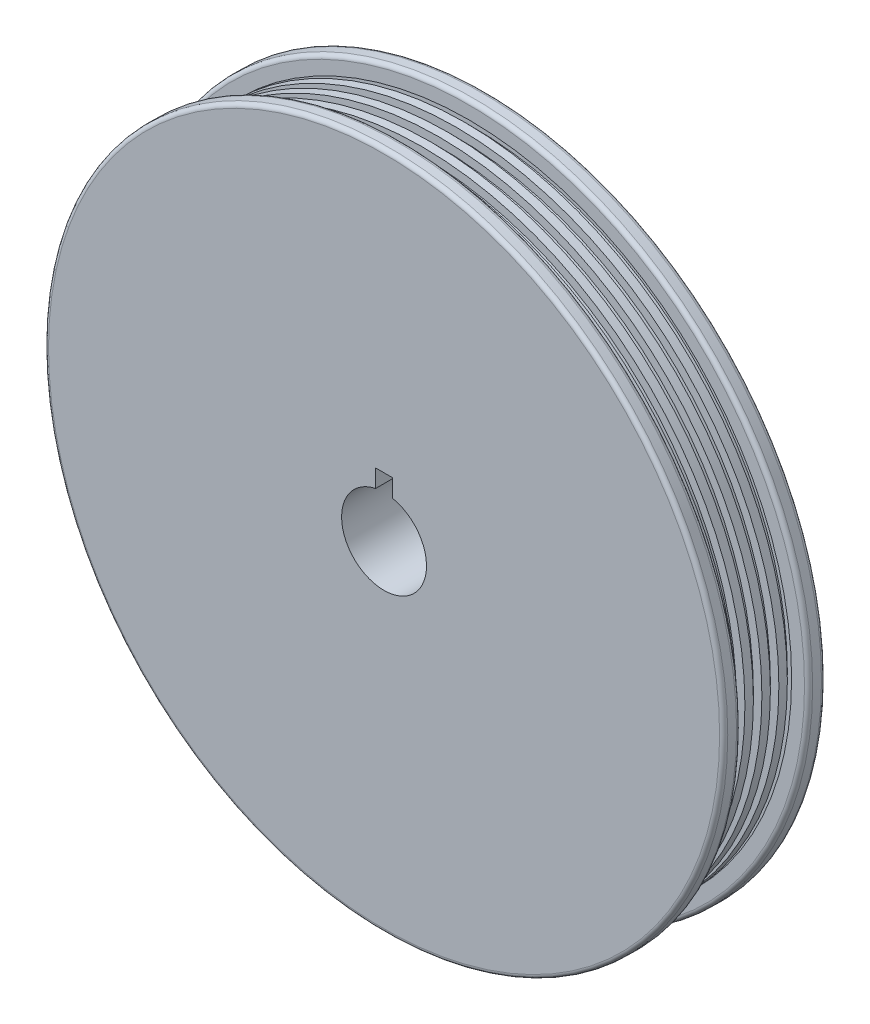
ISO-10303-21;
HEADER;
FILE_DESCRIPTION(('STEP AP214'),'2;1');
FILE_NAME('part.step','',(''),(''),'','','');
FILE_SCHEMA(('AUTOMOTIVE_DESIGN { 1 0 10303 214 1 1 1 1 }'));
ENDSEC;
DATA;
#1=APPLICATION_CONTEXT('core data for automotive mechanical design processes');
#2=APPLICATION_PROTOCOL_DEFINITION('international standard','automotive_design',2000,#1);
#3=PRODUCT_CONTEXT('',#1,'mechanical');
#4=PRODUCT('Part','Part','',(#3));
#5=PRODUCT_RELATED_PRODUCT_CATEGORY('part','',(#4));
#6=PRODUCT_DEFINITION_FORMATION('','',#4);
#7=PRODUCT_DEFINITION_CONTEXT('part definition',#1,'design');
#8=PRODUCT_DEFINITION('design','',#6,#7);
#9=PRODUCT_DEFINITION_SHAPE('','',#8);
#10=(LENGTH_UNIT() NAMED_UNIT(*) SI_UNIT(.MILLI.,.METRE.));
#11=(NAMED_UNIT(*) PLANE_ANGLE_UNIT() SI_UNIT($,.RADIAN.));
#12=(NAMED_UNIT(*) SI_UNIT($,.STERADIAN.) SOLID_ANGLE_UNIT());
#13=UNCERTAINTY_MEASURE_WITH_UNIT(LENGTH_MEASURE(1.E-05),#10,'distance_accuracy_value','');
#14=(GEOMETRIC_REPRESENTATION_CONTEXT(3) GLOBAL_UNCERTAINTY_ASSIGNED_CONTEXT((#13)) GLOBAL_UNIT_ASSIGNED_CONTEXT((#10,
#11,#12)) REPRESENTATION_CONTEXT('',''));
#15=CARTESIAN_POINT('',(0.,0.,0.));
#16=DIRECTION('',(0.,0.,1.));
#17=DIRECTION('',(1.,0.,0.));
#18=AXIS2_PLACEMENT_3D('',#15,#16,#17);
#19=CARTESIAN_POINT('',(0.,0.,19.05));
#20=DIRECTION('',(0.,0.,-1.));
#21=DIRECTION('',(-1.,0.,0.));
#22=AXIS2_PLACEMENT_3D('',#19,#20,#21);
#23=CYLINDRICAL_SURFACE('',#22,127.);
#24=CARTESIAN_POINT('',(0.,0.,-17.526));
#25=DIRECTION('',(0.,0.,1.));
#26=DIRECTION('',(1.,0.,0.));
#27=AXIS2_PLACEMENT_3D('',#24,#25,#26);
#28=CIRCLE('',#27,127.);
#29=CARTESIAN_POINT('',(-127.,0.,-17.526));
#30=VERTEX_POINT('',#29);
#31=EDGE_CURVE('E180',#30,#30,#28,.T.);
#32=CARTESIAN_POINT('',(0.,0.,-14.224));
#33=DIRECTION('',(0.,0.,1.));
#34=DIRECTION('',(1.,0.,0.));
#35=AXIS2_PLACEMENT_3D('',#32,#33,#34);
#36=CIRCLE('',#35,127.);
#37=CARTESIAN_POINT('',(-127.,0.,-14.224));
#38=VERTEX_POINT('',#37);
#39=EDGE_CURVE('E175',#38,#38,#36,.F.);
#40=CARTESIAN_POINT('',(-127.,0.,-17.526));
#41=CARTESIAN_POINT('',(-127.,0.,-17.4916041666667));
#42=CARTESIAN_POINT('',(-127.,0.,-17.4572083333333));
#43=CARTESIAN_POINT('',(-127.,0.,-17.3884166666667));
#44=CARTESIAN_POINT('',(-127.,0.,-17.3540208333333));
#45=CARTESIAN_POINT('',(-127.,0.,-17.2852291666667));
#46=CARTESIAN_POINT('',(-127.,0.,-17.2508333333333));
#47=CARTESIAN_POINT('',(-127.,0.,-17.1820416666667));
#48=CARTESIAN_POINT('',(-127.,0.,-17.1476458333333));
#49=CARTESIAN_POINT('',(-127.,0.,-17.0788541666667));
#50=CARTESIAN_POINT('',(-127.,0.,-17.0444583333333));
#51=CARTESIAN_POINT('',(-127.,0.,-16.9756666666667));
#52=CARTESIAN_POINT('',(-127.,0.,-16.9412708333333));
#53=CARTESIAN_POINT('',(-127.,0.,-16.8724791666667));
#54=CARTESIAN_POINT('',(-127.,0.,-16.8380833333333));
#55=CARTESIAN_POINT('',(-127.,0.,-16.7692916666667));
#56=CARTESIAN_POINT('',(-127.,0.,-16.7348958333333));
#57=CARTESIAN_POINT('',(-127.,0.,-16.6661041666667));
#58=CARTESIAN_POINT('',(-127.,0.,-16.6317083333333));
#59=CARTESIAN_POINT('',(-127.,0.,-16.5629166666667));
#60=CARTESIAN_POINT('',(-127.,0.,-16.5285208333333));
#61=CARTESIAN_POINT('',(-127.,0.,-16.4597291666667));
#62=CARTESIAN_POINT('',(-127.,0.,-16.4253333333333));
#63=CARTESIAN_POINT('',(-127.,0.,-16.3565416666667));
#64=CARTESIAN_POINT('',(-127.,0.,-16.3221458333333));
#65=CARTESIAN_POINT('',(-127.,0.,-16.2533541666667));
#66=CARTESIAN_POINT('',(-127.,0.,-16.2189583333333));
#67=CARTESIAN_POINT('',(-127.,0.,-16.1501666666667));
#68=CARTESIAN_POINT('',(-127.,0.,-16.1157708333333));
#69=CARTESIAN_POINT('',(-127.,0.,-16.0469791666667));
#70=CARTESIAN_POINT('',(-127.,0.,-16.0125833333333));
#71=CARTESIAN_POINT('',(-127.,0.,-15.9437916666667));
#72=CARTESIAN_POINT('',(-127.,0.,-15.9093958333333));
#73=CARTESIAN_POINT('',(-127.,0.,-15.8406041666667));
#74=CARTESIAN_POINT('',(-127.,0.,-15.8062083333333));
#75=CARTESIAN_POINT('',(-127.,0.,-15.7374166666667));
#76=CARTESIAN_POINT('',(-127.,0.,-15.7030208333333));
#77=CARTESIAN_POINT('',(-127.,0.,-15.6342291666667));
#78=CARTESIAN_POINT('',(-127.,0.,-15.5998333333333));
#79=CARTESIAN_POINT('',(-127.,0.,-15.5310416666667));
#80=CARTESIAN_POINT('',(-127.,0.,-15.4966458333333));
#81=CARTESIAN_POINT('',(-127.,0.,-15.4278541666667));
#82=CARTESIAN_POINT('',(-127.,0.,-15.3934583333333));
#83=CARTESIAN_POINT('',(-127.,0.,-15.3246666666667));
#84=CARTESIAN_POINT('',(-127.,0.,-15.2902708333333));
#85=CARTESIAN_POINT('',(-127.,0.,-15.2214791666667));
#86=CARTESIAN_POINT('',(-127.,0.,-15.1870833333333));
#87=CARTESIAN_POINT('',(-127.,0.,-15.1182916666667));
#88=CARTESIAN_POINT('',(-127.,0.,-15.0838958333333));
#89=CARTESIAN_POINT('',(-127.,0.,-15.0151041666667));
#90=CARTESIAN_POINT('',(-127.,0.,-14.9807083333333));
#91=CARTESIAN_POINT('',(-127.,0.,-14.9119166666667));
#92=CARTESIAN_POINT('',(-127.,0.,-14.8775208333333));
#93=CARTESIAN_POINT('',(-127.,0.,-14.8087291666667));
#94=CARTESIAN_POINT('',(-127.,0.,-14.7743333333333));
#95=CARTESIAN_POINT('',(-127.,0.,-14.7055416666667));
#96=CARTESIAN_POINT('',(-127.,0.,-14.6711458333333));
#97=CARTESIAN_POINT('',(-127.,0.,-14.6023541666667));
#98=CARTESIAN_POINT('',(-127.,0.,-14.5679583333333));
#99=CARTESIAN_POINT('',(-127.,0.,-14.4991666666667));
#100=CARTESIAN_POINT('',(-127.,0.,-14.4647708333333));
#101=CARTESIAN_POINT('',(-127.,0.,-14.3959791666667));
#102=CARTESIAN_POINT('',(-127.,0.,-14.3615833333333));
#103=CARTESIAN_POINT('',(-127.,0.,-14.2927916666667));
#104=CARTESIAN_POINT('',(-127.,0.,-14.2583958333333));
#105=CARTESIAN_POINT('',(-127.,0.,-14.224));
#106=B_SPLINE_CURVE_WITH_KNOTS('',3,(#40,#41,#42,#43,#44,#45,#46,#47,#48,#49,#50,#51,#52,#53,
#54,#55,#56,#57,#58,#59,#60,#61,#62,#63,#64,#65,#66,#67,#68,#69,#70,#71,#72,#73,#74,#75,#76,#77,
#78,#79,#80,#81,#82,#83,#84,#85,#86,#87,#88,#89,#90,#91,#92,#93,#94,#95,#96,#97,#98,#99,#100,
#101,#102,#103,#104,#105),.UNSPECIFIED.,.F.,.F.,(4,2,2,2,2,2,2,2,2,2,2,2,2,2,2,2,2,2,2,2,2,2,2,
2,2,2,2,2,2,2,2,2,4),(0.,0.103187499999997,0.206375000000002,0.309562499999999,
0.412750000000003,0.515937500000001,0.619124999999998,0.722312500000002,0.8255,
0.928687499999997,1.031875,1.1350625,1.23825,1.3414375,1.444625,1.5478125,1.651,1.7541875,
1.857375,1.9605625,2.06375,2.1669375,2.270125,2.3733125,2.4765,2.5796875,2.682875,2.7860625,
2.88925,2.9924375,3.095625,3.1988125,3.302),.UNSPECIFIED.);
#107=EDGE_CURVE('BSEAM33',#30,#38,#106,.T.);
#108=ORIENTED_EDGE('',*,*,#31,.T.);
#109=ORIENTED_EDGE('',*,*,#39,.T.);
#110=ORIENTED_EDGE('',*,*,#107,.T.);
#111=ORIENTED_EDGE('',*,*,#107,.F.);
#112=EDGE_LOOP('',(#108,#110,#109,#111));
#113=FACE_BOUND('',#112,.T.);
#114=ADVANCED_FACE('F33',(#113),#23,.T.);
#115=CARTESIAN_POINT('',(0.,0.,-19.05));
#116=DIRECTION('',(0.,0.,1.));
#117=DIRECTION('',(1.,0.,0.));
#118=AXIS2_PLACEMENT_3D('',#115,#116,#117);
#119=PLANE('',#118);
#120=DIRECTION('',(0.,-1.,0.));
#121=VECTOR('',#120,1.);
#122=CARTESIAN_POINT('',(-3.175,0.,-19.05));
#123=LINE('',#122,#121);
#124=CARTESIAN_POINT('',(-3.175,22.225,-19.05));
#125=VERTEX_POINT('',#124);
#126=CARTESIAN_POINT('',(-3.175,15.5542598666732,-19.05));
#127=VERTEX_POINT('',#126);
#128=EDGE_CURVE('E105',#125,#127,#123,.T.);
#129=ORIENTED_EDGE('',*,*,#128,.T.);
#130=CARTESIAN_POINT('',(0.,0.,-19.05));
#131=DIRECTION('',(0.,0.,1.));
#132=DIRECTION('',(1.,0.,0.));
#133=AXIS2_PLACEMENT_3D('',#130,#131,#132);
#134=CIRCLE('',#133,15.875);
#135=CARTESIAN_POINT('',(3.175,15.5542598666732,-19.05));
#136=VERTEX_POINT('',#135);
#137=EDGE_CURVE('E108',#127,#136,#134,.T.);
#138=ORIENTED_EDGE('',*,*,#137,.T.);
#139=DIRECTION('',(0.,1.,0.));
#140=VECTOR('',#139,1.);
#141=CARTESIAN_POINT('',(3.175,0.,-19.05));
#142=LINE('',#141,#140);
#143=CARTESIAN_POINT('',(3.175,22.225,-19.05));
#144=VERTEX_POINT('',#143);
#145=EDGE_CURVE('E100',#136,#144,#142,.T.);
#146=ORIENTED_EDGE('',*,*,#145,.T.);
#147=DIRECTION('',(-1.,0.,0.));
#148=VECTOR('',#147,1.);
#149=CARTESIAN_POINT('',(0.,22.225,-19.05));
#150=LINE('',#149,#148);
#151=EDGE_CURVE('E80',#144,#125,#150,.T.);
#152=ORIENTED_EDGE('',*,*,#151,.T.);
#153=EDGE_LOOP('',(#129,#138,#146,#152));
#154=FACE_BOUND('',#153,.T.);
#155=CARTESIAN_POINT('',(0.,0.,-19.05));
#156=DIRECTION('',(0.,0.,1.));
#157=DIRECTION('',(1.,0.,0.));
#158=AXIS2_PLACEMENT_3D('',#155,#156,#157);
#159=CIRCLE('',#158,125.476);
#160=CARTESIAN_POINT('',(125.476,0.,-19.05));
#161=VERTEX_POINT('',#160);
#162=EDGE_CURVE('E183',#161,#161,#159,.F.);
#163=ORIENTED_EDGE('',*,*,#162,.T.);
#164=EDGE_LOOP('',(#163));
#165=FACE_BOUND('',#164,.T.);
#166=ADVANCED_FACE('F218',(#154,#165),#119,.F.);
#167=CARTESIAN_POINT('',(0.,0.,-12.7));
#168=DIRECTION('',(0.,0.,1.));
#169=DIRECTION('',(1.,0.,0.));
#170=AXIS2_PLACEMENT_3D('',#167,#168,#169);
#171=PLANE('',#170);
#172=CARTESIAN_POINT('',(0.,0.,-12.7));
#173=DIRECTION('',(0.,0.,1.));
#174=DIRECTION('',(1.,0.,0.));
#175=AXIS2_PLACEMENT_3D('',#172,#173,#174);
#176=CIRCLE('',#175,125.476);
#177=CARTESIAN_POINT('',(125.476,0.,-12.7));
#178=VERTEX_POINT('',#177);
#179=EDGE_CURVE('E11',#178,#178,#176,.T.);
#180=ORIENTED_EDGE('',*,*,#179,.T.);
#181=EDGE_LOOP('',(#180));
#182=FACE_BOUND('',#181,.T.);
#183=CARTESIAN_POINT('',(0.,0.,-12.7));
#184=DIRECTION('',(0.,0.,1.));
#185=DIRECTION('',(1.,0.,0.));
#186=AXIS2_PLACEMENT_3D('',#183,#184,#185);
#187=CIRCLE('',#186,120.65);
#188=CARTESIAN_POINT('',(120.65,0.,-12.7));
#189=VERTEX_POINT('',#188);
#190=EDGE_CURVE('E162',#189,#189,#187,.T.);
#191=ORIENTED_EDGE('',*,*,#190,.F.);
#192=EDGE_LOOP('',(#191));
#193=FACE_BOUND('',#192,.T.);
#194=ADVANCED_FACE('F224',(#182,#193),#171,.T.);
#195=CARTESIAN_POINT('',(0.,0.,-17.526));
#196=DIRECTION('',(0.,0.,1.));
#197=DIRECTION('',(1.,0.,0.));
#198=AXIS2_PLACEMENT_3D('',#195,#196,#197);
#199=TOROIDAL_SURFACE('',#198,125.476,1.524);
#200=ORIENTED_EDGE('',*,*,#162,.F.);
#201=EDGE_LOOP('',(#200));
#202=FACE_BOUND('',#201,.T.);
#203=ORIENTED_EDGE('',*,*,#31,.F.);
#204=EDGE_LOOP('',(#203));
#205=FACE_BOUND('',#204,.T.);
#206=ADVANCED_FACE('F233',(#202,#205),#199,.T.);
#207=CARTESIAN_POINT('',(0.,0.,-14.224));
#208=DIRECTION('',(0.,0.,1.));
#209=DIRECTION('',(1.,0.,0.));
#210=AXIS2_PLACEMENT_3D('',#207,#208,#209);
#211=TOROIDAL_SURFACE('',#210,125.476,1.524);
#212=ORIENTED_EDGE('',*,*,#39,.F.);
#213=EDGE_LOOP('',(#212));
#214=FACE_BOUND('',#213,.T.);
#215=ORIENTED_EDGE('',*,*,#179,.F.);
#216=EDGE_LOOP('',(#215));
#217=FACE_BOUND('',#216,.T.);
#218=ADVANCED_FACE('F35',(#214,#217),#211,.T.);
#219=CARTESIAN_POINT('',(0.,0.,-14.2875));
#220=DIRECTION('',(0.,0.,1.));
#221=DIRECTION('',(1.,0.,0.));
#222=AXIS2_PLACEMENT_3D('',#219,#220,#221);
#223=CYLINDRICAL_SURFACE('',#222,120.65);
#224=ORIENTED_EDGE('',*,*,#190,.T.);
#225=EDGE_LOOP('',(#224));
#226=FACE_BOUND('',#225,.T.);
#227=CARTESIAN_POINT('',(0.,0.,-14.2875));
#228=DIRECTION('',(0.,0.,1.));
#229=DIRECTION('',(1.,0.,0.));
#230=AXIS2_PLACEMENT_3D('',#227,#228,#229);
#231=CIRCLE('',#230,120.65);
#232=CARTESIAN_POINT('',(120.65,0.,-14.2875));
#233=VERTEX_POINT('',#232);
#234=EDGE_CURVE('E118',#233,#233,#231,.T.);
#235=ORIENTED_EDGE('',*,*,#234,.F.);
#236=EDGE_LOOP('',(#235));
#237=FACE_BOUND('',#236,.T.);
#238=ADVANCED_FACE('F232',(#226,#237),#223,.F.);
#239=CARTESIAN_POINT('',(0.,0.,-14.2875));
#240=DIRECTION('',(0.,0.,1.));
#241=DIRECTION('',(1.,0.,0.));
#242=AXIS2_PLACEMENT_3D('',#239,#240,#241);
#243=PLANE('',#242);
#244=CARTESIAN_POINT('',(0.,0.,-14.2875));
#245=DIRECTION('',(0.,0.,1.));
#246=DIRECTION('',(1.,0.,0.));
#247=AXIS2_PLACEMENT_3D('',#244,#245,#246);
#248=CIRCLE('',#247,117.475);
#249=CARTESIAN_POINT('',(117.475,0.,-14.2875));
#250=VERTEX_POINT('',#249);
#251=EDGE_CURVE('E112',#250,#250,#248,.T.);
#252=ORIENTED_EDGE('',*,*,#251,.F.);
#253=EDGE_LOOP('',(#252));
#254=FACE_BOUND('',#253,.T.);
#255=ORIENTED_EDGE('',*,*,#234,.T.);
#256=EDGE_LOOP('',(#255));
#257=FACE_BOUND('',#256,.T.);
#258=ADVANCED_FACE('F243',(#254,#257),#243,.T.);
#259=CARTESIAN_POINT('',(0.,0.,-11.1125));
#260=DIRECTION('',(0.,0.,1.));
#261=DIRECTION('',(1.,0.,0.));
#262=AXIS2_PLACEMENT_3D('',#259,#260,#261);
#263=PLANE('',#262);
#264=CARTESIAN_POINT('',(0.,0.,-11.1125));
#265=DIRECTION('',(0.,0.,1.));
#266=DIRECTION('',(1.,0.,0.));
#267=AXIS2_PLACEMENT_3D('',#264,#265,#266);
#268=CIRCLE('',#267,117.475);
#269=CARTESIAN_POINT('',(117.475,0.,-11.1125));
#270=VERTEX_POINT('',#269);
#271=EDGE_CURVE('E111',#270,#270,#268,.T.);
#272=ORIENTED_EDGE('',*,*,#271,.T.);
#273=EDGE_LOOP('',(#272));
#274=FACE_BOUND('',#273,.T.);
#275=CARTESIAN_POINT('',(0.,0.,-11.1125));
#276=DIRECTION('',(0.,0.,1.));
#277=DIRECTION('',(1.,0.,0.));
#278=AXIS2_PLACEMENT_3D('',#275,#276,#277);
#279=CIRCLE('',#278,120.65);
#280=CARTESIAN_POINT('',(120.65,0.,-11.1125));
#281=VERTEX_POINT('',#280);
#282=EDGE_CURVE('E115',#281,#281,#279,.T.);
#283=ORIENTED_EDGE('',*,*,#282,.F.);
#284=EDGE_LOOP('',(#283));
#285=FACE_BOUND('',#284,.T.);
#286=ADVANCED_FACE('F248',(#274,#285),#263,.F.);
#287=CARTESIAN_POINT('',(0.,0.,-14.2875));
#288=DIRECTION('',(0.,0.,1.));
#289=DIRECTION('',(1.,0.,0.));
#290=AXIS2_PLACEMENT_3D('',#287,#288,#289);
#291=CYLINDRICAL_SURFACE('',#290,117.475);
#292=ORIENTED_EDGE('',*,*,#251,.T.);
#293=EDGE_LOOP('',(#292));
#294=FACE_BOUND('',#293,.T.);
#295=ORIENTED_EDGE('',*,*,#271,.F.);
#296=EDGE_LOOP('',(#295));
#297=FACE_BOUND('',#296,.T.);
#298=ADVANCED_FACE('F254',(#294,#297),#291,.T.);
#299=CARTESIAN_POINT('',(0.,0.,-12.7));
#300=DIRECTION('',(0.,0.,1.));
#301=DIRECTION('',(1.,0.,0.));
#302=AXIS2_PLACEMENT_3D('',#299,#300,#301);
#303=CYLINDRICAL_SURFACE('',#302,120.65);
#304=ORIENTED_EDGE('',*,*,#282,.T.);
#305=EDGE_LOOP('',(#304));
#306=FACE_BOUND('',#305,.T.);
#307=CARTESIAN_POINT('',(0.,0.,-7.9375));
#308=DIRECTION('',(0.,0.,1.));
#309=DIRECTION('',(1.,0.,0.));
#310=AXIS2_PLACEMENT_3D('',#307,#308,#309);
#311=CIRCLE('',#310,120.65);
#312=CARTESIAN_POINT('',(120.65,0.,-7.9375));
#313=VERTEX_POINT('',#312);
#314=EDGE_CURVE('E131',#313,#313,#311,.T.);
#315=ORIENTED_EDGE('',*,*,#314,.F.);
#316=EDGE_LOOP('',(#315));
#317=FACE_BOUND('',#316,.T.);
#318=ADVANCED_FACE('F287',(#306,#317),#303,.T.);
#319=CARTESIAN_POINT('',(0.,0.,-7.9375));
#320=DIRECTION('',(0.,0.,1.));
#321=DIRECTION('',(1.,0.,0.));
#322=AXIS2_PLACEMENT_3D('',#319,#320,#321);
#323=PLANE('',#322);
#324=CARTESIAN_POINT('',(0.,0.,-7.9375));
#325=DIRECTION('',(0.,0.,1.));
#326=DIRECTION('',(1.,0.,0.));
#327=AXIS2_PLACEMENT_3D('',#324,#325,#326);
#328=CIRCLE('',#327,117.475);
#329=CARTESIAN_POINT('',(117.475,0.,-7.9375));
#330=VERTEX_POINT('',#329);
#331=EDGE_CURVE('E138',#330,#330,#328,.T.);
#332=ORIENTED_EDGE('',*,*,#331,.F.);
#333=EDGE_LOOP('',(#332));
#334=FACE_BOUND('',#333,.T.);
#335=ORIENTED_EDGE('',*,*,#314,.T.);
#336=EDGE_LOOP('',(#335));
#337=FACE_BOUND('',#336,.T.);
#338=ADVANCED_FACE('F284',(#334,#337),#323,.T.);
#339=CARTESIAN_POINT('',(0.,0.,-4.7625));
#340=DIRECTION('',(0.,0.,1.));
#341=DIRECTION('',(1.,0.,0.));
#342=AXIS2_PLACEMENT_3D('',#339,#340,#341);
#343=PLANE('',#342);
#344=CARTESIAN_POINT('',(0.,0.,-4.7625));
#345=DIRECTION('',(0.,0.,1.));
#346=DIRECTION('',(1.,0.,0.));
#347=AXIS2_PLACEMENT_3D('',#344,#345,#346);
#348=CIRCLE('',#347,117.475);
#349=CARTESIAN_POINT('',(117.475,0.,-4.7625));
#350=VERTEX_POINT('',#349);
#351=EDGE_CURVE('E121',#350,#350,#348,.T.);
#352=ORIENTED_EDGE('',*,*,#351,.T.);
#353=EDGE_LOOP('',(#352));
#354=FACE_BOUND('',#353,.T.);
#355=CARTESIAN_POINT('',(0.,0.,-4.7625));
#356=DIRECTION('',(0.,0.,1.));
#357=DIRECTION('',(1.,0.,0.));
#358=AXIS2_PLACEMENT_3D('',#355,#356,#357);
#359=CIRCLE('',#358,120.65);
#360=CARTESIAN_POINT('',(120.65,0.,-4.7625));
#361=VERTEX_POINT('',#360);
#362=EDGE_CURVE('E141',#361,#361,#359,.T.);
#363=ORIENTED_EDGE('',*,*,#362,.F.);
#364=EDGE_LOOP('',(#363));
#365=FACE_BOUND('',#364,.T.);
#366=ADVANCED_FACE('F282',(#354,#365),#343,.F.);
#367=CARTESIAN_POINT('',(0.,0.,-7.9375));
#368=DIRECTION('',(0.,0.,1.));
#369=DIRECTION('',(1.,0.,0.));
#370=AXIS2_PLACEMENT_3D('',#367,#368,#369);
#371=CYLINDRICAL_SURFACE('',#370,117.475);
#372=ORIENTED_EDGE('',*,*,#331,.T.);
#373=EDGE_LOOP('',(#372));
#374=FACE_BOUND('',#373,.T.);
#375=ORIENTED_EDGE('',*,*,#351,.F.);
#376=EDGE_LOOP('',(#375));
#377=FACE_BOUND('',#376,.T.);
#378=ADVANCED_FACE('F278',(#374,#377),#371,.T.);
#379=CARTESIAN_POINT('',(0.,0.,-1.5875));
#380=DIRECTION('',(0.,0.,1.));
#381=DIRECTION('',(1.,0.,0.));
#382=AXIS2_PLACEMENT_3D('',#379,#380,#381);
#383=PLANE('',#382);
#384=CARTESIAN_POINT('',(0.,0.,-1.5875));
#385=DIRECTION('',(0.,0.,1.));
#386=DIRECTION('',(1.,0.,0.));
#387=AXIS2_PLACEMENT_3D('',#384,#385,#386);
#388=CIRCLE('',#387,117.475);
#389=CARTESIAN_POINT('',(117.475,0.,-1.5875));
#390=VERTEX_POINT('',#389);
#391=EDGE_CURVE('E166',#390,#390,#388,.T.);
#392=ORIENTED_EDGE('',*,*,#391,.F.);
#393=EDGE_LOOP('',(#392));
#394=FACE_BOUND('',#393,.T.);
#395=CARTESIAN_POINT('',(0.,0.,-1.5875));
#396=DIRECTION('',(0.,0.,1.));
#397=DIRECTION('',(1.,0.,0.));
#398=AXIS2_PLACEMENT_3D('',#395,#396,#397);
#399=CIRCLE('',#398,120.65);
#400=CARTESIAN_POINT('',(120.65,0.,-1.5875));
#401=VERTEX_POINT('',#400);
#402=EDGE_CURVE('E172',#401,#401,#399,.T.);
#403=ORIENTED_EDGE('',*,*,#402,.T.);
#404=EDGE_LOOP('',(#403));
#405=FACE_BOUND('',#404,.T.);
#406=ADVANCED_FACE('F281',(#394,#405),#383,.T.);
#407=ORIENTED_EDGE('',*,*,#362,.T.);
#408=EDGE_LOOP('',(#407));
#409=FACE_BOUND('',#408,.T.);
#410=ORIENTED_EDGE('',*,*,#402,.F.);
#411=EDGE_LOOP('',(#410));
#412=FACE_BOUND('',#411,.T.);
#413=ADVANCED_FACE('F309',(#409,#412),#303,.T.);
#414=CARTESIAN_POINT('',(0.,0.,-1.5875));
#415=DIRECTION('',(0.,0.,1.));
#416=DIRECTION('',(1.,0.,0.));
#417=AXIS2_PLACEMENT_3D('',#414,#415,#416);
#418=CYLINDRICAL_SURFACE('',#417,117.475);
#419=ORIENTED_EDGE('',*,*,#391,.T.);
#420=EDGE_LOOP('',(#419));
#421=FACE_BOUND('',#420,.T.);
#422=CARTESIAN_POINT('',(0.,0.,1.5875));
#423=DIRECTION('',(0.,0.,1.));
#424=DIRECTION('',(1.,0.,0.));
#425=AXIS2_PLACEMENT_3D('',#422,#423,#424);
#426=CIRCLE('',#425,117.475);
#427=CARTESIAN_POINT('',(117.475,0.,1.5875));
#428=VERTEX_POINT('',#427);
#429=EDGE_CURVE('E165',#428,#428,#426,.T.);
#430=ORIENTED_EDGE('',*,*,#429,.F.);
#431=EDGE_LOOP('',(#430));
#432=FACE_BOUND('',#431,.T.);
#433=ADVANCED_FACE('F305',(#421,#432),#418,.T.);
#434=CARTESIAN_POINT('',(0.,0.,1.5875));
#435=DIRECTION('',(0.,0.,1.));
#436=DIRECTION('',(1.,0.,0.));
#437=AXIS2_PLACEMENT_3D('',#434,#435,#436);
#438=PLANE('',#437);
#439=ORIENTED_EDGE('',*,*,#429,.T.);
#440=EDGE_LOOP('',(#439));
#441=FACE_BOUND('',#440,.T.);
#442=CARTESIAN_POINT('',(0.,0.,1.5875));
#443=DIRECTION('',(0.,0.,1.));
#444=DIRECTION('',(1.,0.,0.));
#445=AXIS2_PLACEMENT_3D('',#442,#443,#444);
#446=CIRCLE('',#445,120.65);
#447=CARTESIAN_POINT('',(120.65,0.,1.5875));
#448=VERTEX_POINT('',#447);
#449=EDGE_CURVE('E169',#448,#448,#446,.T.);
#450=ORIENTED_EDGE('',*,*,#449,.F.);
#451=EDGE_LOOP('',(#450));
#452=FACE_BOUND('',#451,.T.);
#453=ADVANCED_FACE('F308',(#441,#452),#438,.F.);
#454=ORIENTED_EDGE('',*,*,#449,.T.);
#455=EDGE_LOOP('',(#454));
#456=FACE_BOUND('',#455,.T.);
#457=CARTESIAN_POINT('',(0.,0.,4.7625));
#458=DIRECTION('',(0.,0.,1.));
#459=DIRECTION('',(1.,0.,0.));
#460=AXIS2_PLACEMENT_3D('',#457,#458,#459);
#461=CIRCLE('',#460,120.65);
#462=CARTESIAN_POINT('',(120.65,0.,4.7625));
#463=VERTEX_POINT('',#462);
#464=EDGE_CURVE('E154',#463,#463,#461,.T.);
#465=ORIENTED_EDGE('',*,*,#464,.F.);
#466=EDGE_LOOP('',(#465));
#467=FACE_BOUND('',#466,.T.);
#468=ADVANCED_FACE('F300',(#456,#467),#303,.T.);
#469=CARTESIAN_POINT('',(0.,0.,4.7625));
#470=DIRECTION('',(0.,0.,1.));
#471=DIRECTION('',(1.,0.,0.));
#472=AXIS2_PLACEMENT_3D('',#469,#470,#471);
#473=PLANE('',#472);
#474=CARTESIAN_POINT('',(0.,0.,4.7625));
#475=DIRECTION('',(0.,0.,1.));
#476=DIRECTION('',(1.,0.,0.));
#477=AXIS2_PLACEMENT_3D('',#474,#475,#476);
#478=CIRCLE('',#477,117.475);
#479=CARTESIAN_POINT('',(117.475,0.,4.7625));
#480=VERTEX_POINT('',#479);
#481=EDGE_CURVE('E148',#480,#480,#478,.T.);
#482=ORIENTED_EDGE('',*,*,#481,.F.);
#483=EDGE_LOOP('',(#482));
#484=FACE_BOUND('',#483,.T.);
#485=ORIENTED_EDGE('',*,*,#464,.T.);
#486=EDGE_LOOP('',(#485));
#487=FACE_BOUND('',#486,.T.);
#488=ADVANCED_FACE('F297',(#484,#487),#473,.T.);
#489=CARTESIAN_POINT('',(0.,0.,7.9375));
#490=DIRECTION('',(0.,0.,1.));
#491=DIRECTION('',(1.,0.,0.));
#492=AXIS2_PLACEMENT_3D('',#489,#490,#491);
#493=PLANE('',#492);
#494=CARTESIAN_POINT('',(0.,0.,7.9375));
#495=DIRECTION('',(0.,0.,1.));
#496=DIRECTION('',(1.,0.,0.));
#497=AXIS2_PLACEMENT_3D('',#494,#495,#496);
#498=CIRCLE('',#497,117.475);
#499=CARTESIAN_POINT('',(117.475,0.,7.9375));
#500=VERTEX_POINT('',#499);
#501=EDGE_CURVE('E135',#500,#500,#498,.T.);
#502=ORIENTED_EDGE('',*,*,#501,.T.);
#503=EDGE_LOOP('',(#502));
#504=FACE_BOUND('',#503,.T.);
#505=CARTESIAN_POINT('',(0.,0.,7.9375));
#506=DIRECTION('',(0.,0.,1.));
#507=DIRECTION('',(1.,0.,0.));
#508=AXIS2_PLACEMENT_3D('',#505,#506,#507);
#509=CIRCLE('',#508,120.65);
#510=CARTESIAN_POINT('',(120.65,0.,7.9375));
#511=VERTEX_POINT('',#510);
#512=EDGE_CURVE('E151',#511,#511,#509,.T.);
#513=ORIENTED_EDGE('',*,*,#512,.F.);
#514=EDGE_LOOP('',(#513));
#515=FACE_BOUND('',#514,.T.);
#516=ADVANCED_FACE('F295',(#504,#515),#493,.F.);
#517=CARTESIAN_POINT('',(0.,0.,4.7625));
#518=DIRECTION('',(0.,0.,1.));
#519=DIRECTION('',(1.,0.,0.));
#520=AXIS2_PLACEMENT_3D('',#517,#518,#519);
#521=CYLINDRICAL_SURFACE('',#520,117.475);
#522=ORIENTED_EDGE('',*,*,#481,.T.);
#523=EDGE_LOOP('',(#522));
#524=FACE_BOUND('',#523,.T.);
#525=ORIENTED_EDGE('',*,*,#501,.F.);
#526=EDGE_LOOP('',(#525));
#527=FACE_BOUND('',#526,.T.);
#528=ADVANCED_FACE('F292',(#524,#527),#521,.T.);
#529=ORIENTED_EDGE('',*,*,#512,.T.);
#530=EDGE_LOOP('',(#529));
#531=FACE_BOUND('',#530,.T.);
#532=CARTESIAN_POINT('',(0.,0.,11.1125));
#533=DIRECTION('',(0.,0.,1.));
#534=DIRECTION('',(1.,0.,0.));
#535=AXIS2_PLACEMENT_3D('',#532,#533,#534);
#536=CIRCLE('',#535,120.65);
#537=CARTESIAN_POINT('',(120.65,0.,11.1125));
#538=VERTEX_POINT('',#537);
#539=EDGE_CURVE('E132',#538,#538,#536,.T.);
#540=ORIENTED_EDGE('',*,*,#539,.F.);
#541=EDGE_LOOP('',(#540));
#542=FACE_BOUND('',#541,.T.);
#543=ADVANCED_FACE('F276',(#531,#542),#303,.T.);
#544=CARTESIAN_POINT('',(0.,0.,11.1125));
#545=DIRECTION('',(0.,0.,1.));
#546=DIRECTION('',(1.,0.,0.));
#547=AXIS2_PLACEMENT_3D('',#544,#545,#546);
#548=CYLINDRICAL_SURFACE('',#547,120.65);
#549=CARTESIAN_POINT('',(0.,0.,14.2875));
#550=DIRECTION('',(0.,0.,1.));
#551=DIRECTION('',(1.,0.,0.));
#552=AXIS2_PLACEMENT_3D('',#549,#550,#551);
#553=CIRCLE('',#552,120.65);
#554=CARTESIAN_POINT('',(120.65,0.,14.2875));
#555=VERTEX_POINT('',#554);
#556=EDGE_CURVE('E127',#555,#555,#553,.T.);
#557=ORIENTED_EDGE('',*,*,#556,.T.);
#558=EDGE_LOOP('',(#557));
#559=FACE_BOUND('',#558,.T.);
#560=CARTESIAN_POINT('',(0.,0.,12.7));
#561=DIRECTION('',(0.,0.,1.));
#562=DIRECTION('',(1.,0.,0.));
#563=AXIS2_PLACEMENT_3D('',#560,#561,#562);
#564=CIRCLE('',#563,120.65);
#565=CARTESIAN_POINT('',(120.65,0.,12.7));
#566=VERTEX_POINT('',#565);
#567=EDGE_CURVE('E157',#566,#566,#564,.T.);
#568=ORIENTED_EDGE('',*,*,#567,.F.);
#569=EDGE_LOOP('',(#568));
#570=FACE_BOUND('',#569,.T.);
#571=ADVANCED_FACE('F269',(#559,#570),#548,.F.);
#572=CARTESIAN_POINT('',(0.,0.,11.1125));
#573=DIRECTION('',(0.,0.,1.));
#574=DIRECTION('',(1.,0.,0.));
#575=AXIS2_PLACEMENT_3D('',#572,#573,#574);
#576=PLANE('',#575);
#577=CARTESIAN_POINT('',(0.,0.,11.1125));
#578=DIRECTION('',(0.,0.,1.));
#579=DIRECTION('',(1.,0.,0.));
#580=AXIS2_PLACEMENT_3D('',#577,#578,#579);
#581=CIRCLE('',#580,117.475);
#582=CARTESIAN_POINT('',(117.475,0.,11.1125));
#583=VERTEX_POINT('',#582);
#584=EDGE_CURVE('E124',#583,#583,#581,.T.);
#585=ORIENTED_EDGE('',*,*,#584,.F.);
#586=EDGE_LOOP('',(#585));
#587=FACE_BOUND('',#586,.T.);
#588=ORIENTED_EDGE('',*,*,#539,.T.);
#589=EDGE_LOOP('',(#588));
#590=FACE_BOUND('',#589,.T.);
#591=ADVANCED_FACE('F266',(#587,#590),#576,.T.);
#592=CARTESIAN_POINT('',(0.,0.,14.2875));
#593=DIRECTION('',(0.,0.,1.));
#594=DIRECTION('',(1.,0.,0.));
#595=AXIS2_PLACEMENT_3D('',#592,#593,#594);
#596=PLANE('',#595);
#597=CARTESIAN_POINT('',(0.,0.,14.2875));
#598=DIRECTION('',(0.,0.,1.));
#599=DIRECTION('',(1.,0.,0.));
#600=AXIS2_PLACEMENT_3D('',#597,#598,#599);
#601=CIRCLE('',#600,117.475);
#602=CARTESIAN_POINT('',(117.475,0.,14.2875));
#603=VERTEX_POINT('',#602);
#604=EDGE_CURVE('E128',#603,#603,#601,.T.);
#605=ORIENTED_EDGE('',*,*,#604,.T.);
#606=EDGE_LOOP('',(#605));
#607=FACE_BOUND('',#606,.T.);
#608=ORIENTED_EDGE('',*,*,#556,.F.);
#609=EDGE_LOOP('',(#608));
#610=FACE_BOUND('',#609,.T.);
#611=ADVANCED_FACE('F264',(#607,#610),#596,.F.);
#612=CARTESIAN_POINT('',(0.,0.,11.1125));
#613=DIRECTION('',(0.,0.,1.));
#614=DIRECTION('',(1.,0.,0.));
#615=AXIS2_PLACEMENT_3D('',#612,#613,#614);
#616=CYLINDRICAL_SURFACE('',#615,117.475);
#617=ORIENTED_EDGE('',*,*,#584,.T.);
#618=EDGE_LOOP('',(#617));
#619=FACE_BOUND('',#618,.T.);
#620=ORIENTED_EDGE('',*,*,#604,.F.);
#621=EDGE_LOOP('',(#620));
#622=FACE_BOUND('',#621,.T.);
#623=ADVANCED_FACE('F261',(#619,#622),#616,.T.);
#624=CARTESIAN_POINT('',(0.,0.,19.05));
#625=DIRECTION('',(0.,0.,1.));
#626=DIRECTION('',(1.,0.,0.));
#627=AXIS2_PLACEMENT_3D('',#624,#625,#626);
#628=PLANE('',#627);
#629=CARTESIAN_POINT('',(0.,0.,19.05));
#630=DIRECTION('',(0.,0.,1.));
#631=DIRECTION('',(1.,0.,0.));
#632=AXIS2_PLACEMENT_3D('',#629,#630,#631);
#633=CIRCLE('',#632,15.875);
#634=CARTESIAN_POINT('',(-3.175,15.5542598666732,19.05));
#635=VERTEX_POINT('',#634);
#636=CARTESIAN_POINT('',(3.175,15.5542598666732,19.05));
#637=VERTEX_POINT('',#636);
#638=EDGE_CURVE('E56',#635,#637,#633,.T.);
#639=ORIENTED_EDGE('',*,*,#638,.F.);
#640=DIRECTION('',(0.,-1.,0.));
#641=VECTOR('',#640,1.);
#642=CARTESIAN_POINT('',(-3.175,22.225,19.05));
#643=LINE('',#642,#641);
#644=CARTESIAN_POINT('',(-3.175,22.225,19.05));
#645=VERTEX_POINT('',#644);
#646=EDGE_CURVE('E93',#645,#635,#643,.T.);
#647=ORIENTED_EDGE('',*,*,#646,.F.);
#648=DIRECTION('',(-1.,0.,0.));
#649=VECTOR('',#648,1.);
#650=CARTESIAN_POINT('',(-3.175,22.225,19.05));
#651=LINE('',#650,#649);
#652=CARTESIAN_POINT('',(3.175,22.225,19.05));
#653=VERTEX_POINT('',#652);
#654=EDGE_CURVE('E77',#653,#645,#651,.T.);
#655=ORIENTED_EDGE('',*,*,#654,.F.);
#656=DIRECTION('',(0.,1.,0.));
#657=VECTOR('',#656,1.);
#658=CARTESIAN_POINT('',(3.175,22.225,19.05));
#659=LINE('',#658,#657);
#660=EDGE_CURVE('E86',#637,#653,#659,.T.);
#661=ORIENTED_EDGE('',*,*,#660,.F.);
#662=EDGE_LOOP('',(#639,#647,#655,#661));
#663=FACE_BOUND('',#662,.T.);
#664=CARTESIAN_POINT('',(0.,0.,19.05));
#665=DIRECTION('',(0.,0.,1.));
#666=DIRECTION('',(1.,0.,0.));
#667=AXIS2_PLACEMENT_3D('',#664,#665,#666);
#668=CIRCLE('',#667,125.476);
#669=CARTESIAN_POINT('',(125.476,0.,19.05));
#670=VERTEX_POINT('',#669);
#671=EDGE_CURVE('E186',#670,#670,#668,.T.);
#672=ORIENTED_EDGE('',*,*,#671,.T.);
#673=EDGE_LOOP('',(#672));
#674=FACE_BOUND('',#673,.T.);
#675=ADVANCED_FACE('F90',(#663,#674),#628,.T.);
#676=CARTESIAN_POINT('',(0.,0.,17.526));
#677=DIRECTION('',(0.,0.,1.));
#678=DIRECTION('',(1.,0.,0.));
#679=AXIS2_PLACEMENT_3D('',#676,#677,#678);
#680=TOROIDAL_SURFACE('',#679,125.476,1.524);
#681=CARTESIAN_POINT('',(0.,0.,17.526));
#682=DIRECTION('',(0.,0.,1.));
#683=DIRECTION('',(1.,0.,0.));
#684=AXIS2_PLACEMENT_3D('',#681,#682,#683);
#685=CIRCLE('',#684,127.);
#686=CARTESIAN_POINT('',(-127.,0.,17.526));
#687=VERTEX_POINT('',#686);
#688=EDGE_CURVE('E192',#687,#687,#685,.F.);
#689=ORIENTED_EDGE('',*,*,#688,.F.);
#690=EDGE_LOOP('',(#689));
#691=FACE_BOUND('',#690,.T.);
#692=ORIENTED_EDGE('',*,*,#671,.F.);
#693=EDGE_LOOP('',(#692));
#694=FACE_BOUND('',#693,.T.);
#695=ADVANCED_FACE('F207',(#691,#694),#680,.T.);
#696=CARTESIAN_POINT('',(0.,0.,14.224));
#697=DIRECTION('',(0.,0.,1.));
#698=DIRECTION('',(1.,0.,0.));
#699=AXIS2_PLACEMENT_3D('',#696,#697,#698);
#700=CIRCLE('',#699,127.);
#701=CARTESIAN_POINT('',(-127.,0.,14.224));
#702=VERTEX_POINT('',#701);
#703=EDGE_CURVE('E189',#702,#702,#700,.T.);
#704=CARTESIAN_POINT('',(-127.,0.,17.526));
#705=CARTESIAN_POINT('',(-127.,0.,17.4916041666667));
#706=CARTESIAN_POINT('',(-127.,0.,17.4572083333333));
#707=CARTESIAN_POINT('',(-127.,0.,17.3884166666667));
#708=CARTESIAN_POINT('',(-127.,0.,17.3540208333333));
#709=CARTESIAN_POINT('',(-127.,0.,17.2852291666667));
#710=CARTESIAN_POINT('',(-127.,0.,17.2508333333333));
#711=CARTESIAN_POINT('',(-127.,0.,17.1820416666667));
#712=CARTESIAN_POINT('',(-127.,0.,17.1476458333333));
#713=CARTESIAN_POINT('',(-127.,0.,17.0788541666667));
#714=CARTESIAN_POINT('',(-127.,0.,17.0444583333333));
#715=CARTESIAN_POINT('',(-127.,0.,16.9756666666667));
#716=CARTESIAN_POINT('',(-127.,0.,16.9412708333333));
#717=CARTESIAN_POINT('',(-127.,0.,16.8724791666667));
#718=CARTESIAN_POINT('',(-127.,0.,16.8380833333333));
#719=CARTESIAN_POINT('',(-127.,0.,16.7692916666667));
#720=CARTESIAN_POINT('',(-127.,0.,16.7348958333333));
#721=CARTESIAN_POINT('',(-127.,0.,16.6661041666667));
#722=CARTESIAN_POINT('',(-127.,0.,16.6317083333333));
#723=CARTESIAN_POINT('',(-127.,0.,16.5629166666667));
#724=CARTESIAN_POINT('',(-127.,0.,16.5285208333333));
#725=CARTESIAN_POINT('',(-127.,0.,16.4597291666667));
#726=CARTESIAN_POINT('',(-127.,0.,16.4253333333333));
#727=CARTESIAN_POINT('',(-127.,0.,16.3565416666667));
#728=CARTESIAN_POINT('',(-127.,0.,16.3221458333333));
#729=CARTESIAN_POINT('',(-127.,0.,16.2533541666667));
#730=CARTESIAN_POINT('',(-127.,0.,16.2189583333333));
#731=CARTESIAN_POINT('',(-127.,0.,16.1501666666667));
#732=CARTESIAN_POINT('',(-127.,0.,16.1157708333333));
#733=CARTESIAN_POINT('',(-127.,0.,16.0469791666667));
#734=CARTESIAN_POINT('',(-127.,0.,16.0125833333333));
#735=CARTESIAN_POINT('',(-127.,0.,15.9437916666667));
#736=CARTESIAN_POINT('',(-127.,0.,15.9093958333333));
#737=CARTESIAN_POINT('',(-127.,0.,15.8406041666667));
#738=CARTESIAN_POINT('',(-127.,0.,15.8062083333333));
#739=CARTESIAN_POINT('',(-127.,0.,15.7374166666667));
#740=CARTESIAN_POINT('',(-127.,0.,15.7030208333333));
#741=CARTESIAN_POINT('',(-127.,0.,15.6342291666667));
#742=CARTESIAN_POINT('',(-127.,0.,15.5998333333333));
#743=CARTESIAN_POINT('',(-127.,0.,15.5310416666667));
#744=CARTESIAN_POINT('',(-127.,0.,15.4966458333333));
#745=CARTESIAN_POINT('',(-127.,0.,15.4278541666667));
#746=CARTESIAN_POINT('',(-127.,0.,15.3934583333333));
#747=CARTESIAN_POINT('',(-127.,0.,15.3246666666667));
#748=CARTESIAN_POINT('',(-127.,0.,15.2902708333333));
#749=CARTESIAN_POINT('',(-127.,0.,15.2214791666667));
#750=CARTESIAN_POINT('',(-127.,0.,15.1870833333333));
#751=CARTESIAN_POINT('',(-127.,0.,15.1182916666667));
#752=CARTESIAN_POINT('',(-127.,0.,15.0838958333333));
#753=CARTESIAN_POINT('',(-127.,0.,15.0151041666667));
#754=CARTESIAN_POINT('',(-127.,0.,14.9807083333333));
#755=CARTESIAN_POINT('',(-127.,0.,14.9119166666667));
#756=CARTESIAN_POINT('',(-127.,0.,14.8775208333333));
#757=CARTESIAN_POINT('',(-127.,0.,14.8087291666667));
#758=CARTESIAN_POINT('',(-127.,0.,14.7743333333333));
#759=CARTESIAN_POINT('',(-127.,0.,14.7055416666667));
#760=CARTESIAN_POINT('',(-127.,0.,14.6711458333333));
#761=CARTESIAN_POINT('',(-127.,0.,14.6023541666667));
#762=CARTESIAN_POINT('',(-127.,0.,14.5679583333333));
#763=CARTESIAN_POINT('',(-127.,0.,14.4991666666667));
#764=CARTESIAN_POINT('',(-127.,0.,14.4647708333333));
#765=CARTESIAN_POINT('',(-127.,0.,14.3959791666667));
#766=CARTESIAN_POINT('',(-127.,0.,14.3615833333333));
#767=CARTESIAN_POINT('',(-127.,0.,14.2927916666667));
#768=CARTESIAN_POINT('',(-127.,0.,14.2583958333333));
#769=CARTESIAN_POINT('',(-127.,0.,14.224));
#770=B_SPLINE_CURVE_WITH_KNOTS('',3,(#704,#705,#706,#707,#708,#709,#710,#711,#712,#713,#714,
#715,#716,#717,#718,#719,#720,#721,#722,#723,#724,#725,#726,#727,#728,#729,#730,#731,#732,#733,
#734,#735,#736,#737,#738,#739,#740,#741,#742,#743,#744,#745,#746,#747,#748,#749,#750,#751,#752,
#753,#754,#755,#756,#757,#758,#759,#760,#761,#762,#763,#764,#765,#766,#767,#768,#769),
.UNSPECIFIED.,.F.,.F.,(4,2,2,2,2,2,2,2,2,2,2,2,2,2,2,2,2,2,2,2,2,2,2,2,2,2,2,2,2,2,2,2,4),(0.,
0.103187499999997,0.206374999999998,0.309562499999999,0.41275,0.515937499999997,
0.619124999999998,0.722312499999999,0.8255,0.928687499999997,1.031875,1.1350625,1.23825,
1.3414375,1.444625,1.5478125,1.651,1.7541875,1.857375,1.9605625,2.06375,2.1669375,2.270125,
2.3733125,2.4765,2.5796875,2.682875,2.7860625,2.88925,2.9924375,3.095625,3.1988125,3.302),.UNSPECIFIED.);
#771=EDGE_CURVE('BSEAM203',#687,#702,#770,.T.);
#772=ORIENTED_EDGE('',*,*,#688,.T.);
#773=ORIENTED_EDGE('',*,*,#703,.T.);
#774=ORIENTED_EDGE('',*,*,#771,.T.);
#775=ORIENTED_EDGE('',*,*,#771,.F.);
#776=EDGE_LOOP('',(#772,#774,#773,#775));
#777=FACE_BOUND('',#776,.T.);
#778=ADVANCED_FACE('F203',(#777),#23,.T.);
#779=CARTESIAN_POINT('',(0.,0.,14.224));
#780=DIRECTION('',(0.,0.,1.));
#781=DIRECTION('',(1.,0.,0.));
#782=AXIS2_PLACEMENT_3D('',#779,#780,#781);
#783=TOROIDAL_SURFACE('',#782,125.476,1.524);
#784=CARTESIAN_POINT('',(0.,0.,12.7));
#785=DIRECTION('',(0.,0.,1.));
#786=DIRECTION('',(1.,0.,0.));
#787=AXIS2_PLACEMENT_3D('',#784,#785,#786);
#788=CIRCLE('',#787,125.476);
#789=CARTESIAN_POINT('',(125.476,0.,12.7));
#790=VERTEX_POINT('',#789);
#791=EDGE_CURVE('E41',#790,#790,#788,.F.);
#792=ORIENTED_EDGE('',*,*,#791,.F.);
#793=EDGE_LOOP('',(#792));
#794=FACE_BOUND('',#793,.T.);
#795=ORIENTED_EDGE('',*,*,#703,.F.);
#796=EDGE_LOOP('',(#795));
#797=FACE_BOUND('',#796,.T.);
#798=ADVANCED_FACE('F200',(#794,#797),#783,.T.);
#799=CARTESIAN_POINT('',(0.,0.,12.7));
#800=DIRECTION('',(0.,0.,1.));
#801=DIRECTION('',(1.,0.,0.));
#802=AXIS2_PLACEMENT_3D('',#799,#800,#801);
#803=PLANE('',#802);
#804=ORIENTED_EDGE('',*,*,#791,.T.);
#805=EDGE_LOOP('',(#804));
#806=FACE_BOUND('',#805,.T.);
#807=ORIENTED_EDGE('',*,*,#567,.T.);
#808=EDGE_LOOP('',(#807));
#809=FACE_BOUND('',#808,.T.);
#810=ADVANCED_FACE('F197',(#806,#809),#803,.F.);
#811=CARTESIAN_POINT('',(0.,0.,-82.55));
#812=DIRECTION('',(0.,0.,1.));
#813=DIRECTION('',(1.,0.,0.));
#814=AXIS2_PLACEMENT_3D('',#811,#812,#813);
#815=CYLINDRICAL_SURFACE('',#814,15.875);
#816=DIRECTION('',(0.,0.,1.));
#817=VECTOR('',#816,1.);
#818=CARTESIAN_POINT('',(-3.175,15.5542598666732,-82.55));
#819=LINE('',#818,#817);
#820=EDGE_CURVE('E98',#127,#635,#819,.T.);
#821=ORIENTED_EDGE('',*,*,#820,.T.);
#822=ORIENTED_EDGE('',*,*,#638,.T.);
#823=DIRECTION('',(0.,0.,1.));
#824=VECTOR('',#823,1.);
#825=CARTESIAN_POINT('',(3.175,15.5542598666732,-82.55));
#826=LINE('',#825,#824);
#827=EDGE_CURVE('E83',#136,#637,#826,.T.);
#828=ORIENTED_EDGE('',*,*,#827,.F.);
#829=ORIENTED_EDGE('',*,*,#137,.F.);
#830=EDGE_LOOP('',(#821,#822,#828,#829));
#831=FACE_BOUND('',#830,.T.);
#832=ADVANCED_FACE('F322',(#831),#815,.F.);
#833=CARTESIAN_POINT('',(-3.175,22.225,-82.55));
#834=DIRECTION('',(-1.,0.,0.));
#835=DIRECTION('',(0.,-1.,0.));
#836=AXIS2_PLACEMENT_3D('',#833,#834,#835);
#837=PLANE('',#836);
#838=DIRECTION('',(0.,0.,1.));
#839=VECTOR('',#838,1.);
#840=CARTESIAN_POINT('',(-3.175,22.225,-82.55));
#841=LINE('',#840,#839);
#842=EDGE_CURVE('E82',#125,#645,#841,.T.);
#843=ORIENTED_EDGE('',*,*,#842,.T.);
#844=ORIENTED_EDGE('',*,*,#646,.T.);
#845=ORIENTED_EDGE('',*,*,#820,.F.);
#846=ORIENTED_EDGE('',*,*,#128,.F.);
#847=EDGE_LOOP('',(#843,#844,#845,#846));
#848=FACE_BOUND('',#847,.T.);
#849=ADVANCED_FACE('F335',(#848),#837,.F.);
#850=CARTESIAN_POINT('',(-3.175,22.225,-82.55));
#851=DIRECTION('',(0.,1.,0.));
#852=DIRECTION('',(0.,0.,1.));
#853=AXIS2_PLACEMENT_3D('',#850,#851,#852);
#854=PLANE('',#853);
#855=DIRECTION('',(0.,0.,1.));
#856=VECTOR('',#855,1.);
#857=CARTESIAN_POINT('',(3.175,22.225,-82.55));
#858=LINE('',#857,#856);
#859=EDGE_CURVE('E48',#144,#653,#858,.T.);
#860=ORIENTED_EDGE('',*,*,#859,.T.);
#861=ORIENTED_EDGE('',*,*,#654,.T.);
#862=ORIENTED_EDGE('',*,*,#842,.F.);
#863=ORIENTED_EDGE('',*,*,#151,.F.);
#864=EDGE_LOOP('',(#860,#861,#862,#863));
#865=FACE_BOUND('',#864,.T.);
#866=ADVANCED_FACE('F74',(#865),#854,.F.);
#867=CARTESIAN_POINT('',(3.175,22.225,-82.55));
#868=DIRECTION('',(1.,0.,0.));
#869=DIRECTION('',(0.,1.,0.));
#870=AXIS2_PLACEMENT_3D('',#867,#868,#869);
#871=PLANE('',#870);
#872=ORIENTED_EDGE('',*,*,#827,.T.);
#873=ORIENTED_EDGE('',*,*,#660,.T.);
#874=ORIENTED_EDGE('',*,*,#859,.F.);
#875=ORIENTED_EDGE('',*,*,#145,.F.);
#876=EDGE_LOOP('',(#872,#873,#874,#875));
#877=FACE_BOUND('',#876,.T.);
#878=ADVANCED_FACE('F87',(#877),#871,.F.);
#879=CLOSED_SHELL('',(#114,#166,#194,#206,#218,#238,#258,#286,#298,#318,#338,#366,#378,#406,
#413,#433,#453,#468,#488,#516,#528,#543,#571,#591,#611,#623,#675,#695,#778,#798,#810,#832,#849,
#866,#878));
#880=MANIFOLD_SOLID_BREP('B2',#879);
#881=ADVANCED_BREP_SHAPE_REPRESENTATION('',(#18,#880),#14);
#882=SHAPE_DEFINITION_REPRESENTATION(#9,#881);
ENDSEC;
END-ISO-10303-21;
